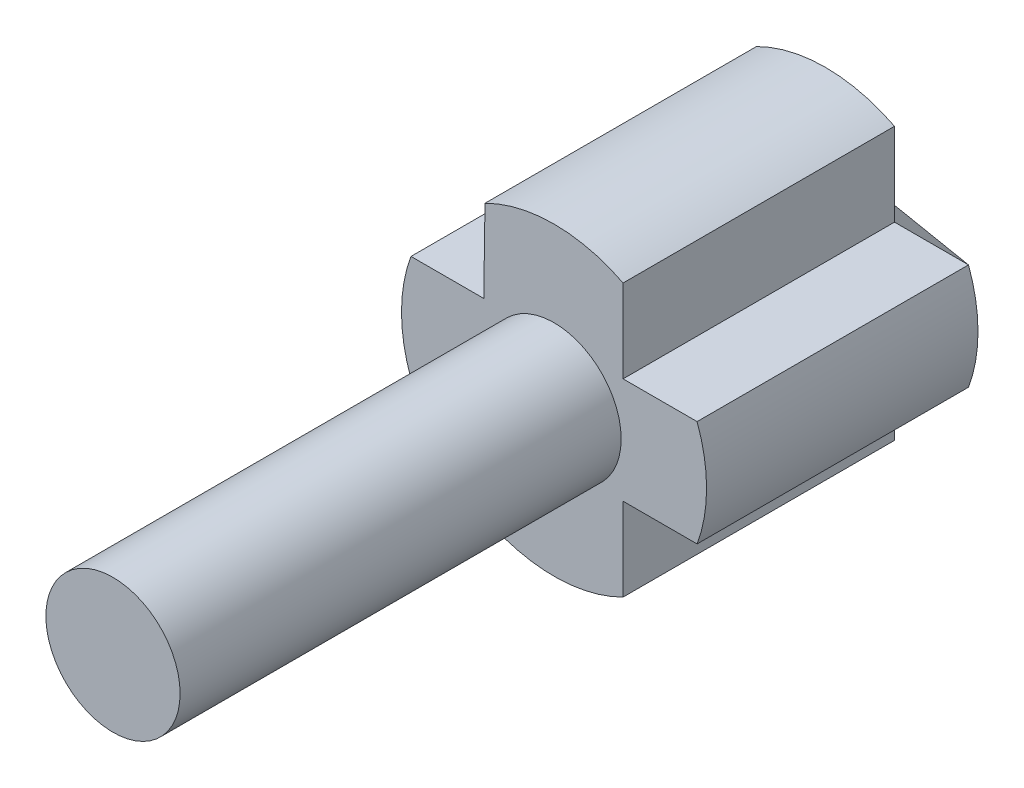
ISO-10303-21;
HEADER;
FILE_DESCRIPTION(('STEP AP214'),'2;1');
FILE_NAME('part.step','',(''),(''),'','','');
FILE_SCHEMA(('AUTOMOTIVE_DESIGN { 1 0 10303 214 1 1 1 1 }'));
ENDSEC;
DATA;
#1=APPLICATION_CONTEXT('core data for automotive mechanical design processes');
#2=APPLICATION_PROTOCOL_DEFINITION('international standard','automotive_design',2000,#1);
#3=PRODUCT_CONTEXT('',#1,'mechanical');
#4=PRODUCT('Part','Part','',(#3));
#5=PRODUCT_RELATED_PRODUCT_CATEGORY('part','',(#4));
#6=PRODUCT_DEFINITION_FORMATION('','',#4);
#7=PRODUCT_DEFINITION_CONTEXT('part definition',#1,'design');
#8=PRODUCT_DEFINITION('design','',#6,#7);
#9=PRODUCT_DEFINITION_SHAPE('','',#8);
#10=(LENGTH_UNIT() NAMED_UNIT(*) SI_UNIT(.MILLI.,.METRE.));
#11=(NAMED_UNIT(*) PLANE_ANGLE_UNIT() SI_UNIT($,.RADIAN.));
#12=(NAMED_UNIT(*) SI_UNIT($,.STERADIAN.) SOLID_ANGLE_UNIT());
#13=UNCERTAINTY_MEASURE_WITH_UNIT(LENGTH_MEASURE(1.E-05),#10,'distance_accuracy_value','');
#14=(GEOMETRIC_REPRESENTATION_CONTEXT(3) GLOBAL_UNCERTAINTY_ASSIGNED_CONTEXT((#13)) GLOBAL_UNIT_ASSIGNED_CONTEXT((#10,
#11,#12)) REPRESENTATION_CONTEXT('',''));
#15=CARTESIAN_POINT('',(0.,0.,0.));
#16=DIRECTION('',(0.,0.,1.));
#17=DIRECTION('',(1.,0.,0.));
#18=AXIS2_PLACEMENT_3D('',#15,#16,#17);
#19=CARTESIAN_POINT('',(0.,0.,130.));
#20=DIRECTION('',(0.,0.,-1.));
#21=DIRECTION('',(-1.,0.,0.));
#22=AXIS2_PLACEMENT_3D('',#19,#20,#21);
#23=CYLINDRICAL_SURFACE('',#22,19.7830134605546);
#24=CARTESIAN_POINT('',(0.,0.,130.));
#25=DIRECTION('',(0.,0.,1.));
#26=DIRECTION('',(1.,0.,0.));
#27=AXIS2_PLACEMENT_3D('',#24,#25,#26);
#28=CIRCLE('',#27,19.7830134605546);
#29=CARTESIAN_POINT('',(19.7830134605546,0.,130.));
#30=VERTEX_POINT('',#29);
#31=EDGE_CURVE('E12',#30,#30,#28,.T.);
#32=ORIENTED_EDGE('',*,*,#31,.F.);
#33=EDGE_LOOP('',(#32));
#34=FACE_BOUND('',#33,.T.);
#35=CARTESIAN_POINT('',(0.,0.,0.));
#36=DIRECTION('',(0.,0.,1.));
#37=DIRECTION('',(1.,0.,0.));
#38=AXIS2_PLACEMENT_3D('',#35,#36,#37);
#39=CIRCLE('',#38,19.7830134605546);
#40=CARTESIAN_POINT('',(19.7830134605546,0.,0.));
#41=VERTEX_POINT('',#40);
#42=EDGE_CURVE('E75',#41,#41,#39,.T.);
#43=ORIENTED_EDGE('',*,*,#42,.T.);
#44=EDGE_LOOP('',(#43));
#45=FACE_BOUND('',#44,.T.);
#46=ADVANCED_FACE('F65',(#34,#45),#23,.T.);
#47=CARTESIAN_POINT('',(0.,0.,130.));
#48=DIRECTION('',(0.,0.,1.));
#49=DIRECTION('',(1.,0.,0.));
#50=AXIS2_PLACEMENT_3D('',#47,#48,#49);
#51=PLANE('',#50);
#52=ORIENTED_EDGE('',*,*,#31,.T.);
#53=EDGE_LOOP('',(#52));
#54=FACE_BOUND('',#53,.T.);
#55=ADVANCED_FACE('F422',(#54),#51,.T.);
#56=CARTESIAN_POINT('',(42.1631050170094,15.615730370312,-80.));
#57=DIRECTION('',(0.,-1.,0.));
#58=DIRECTION('',(1.,0.,0.));
#59=AXIS2_PLACEMENT_3D('',#56,#57,#58);
#60=PLANE('',#59);
#61=DIRECTION('',(1.,0.,0.));
#62=VECTOR('',#61,1.);
#63=CARTESIAN_POINT('',(42.1631050170094,15.615730370312,0.));
#64=LINE('',#63,#62);
#65=CARTESIAN_POINT('',(20.3514494606447,15.615730370312,0.));
#66=VERTEX_POINT('',#65);
#67=CARTESIAN_POINT('',(42.1631050170094,15.615730370312,0.));
#68=VERTEX_POINT('',#67);
#69=EDGE_CURVE('E188',#66,#68,#64,.T.);
#70=ORIENTED_EDGE('',*,*,#69,.T.);
#71=DIRECTION('',(0.,0.,1.));
#72=VECTOR('',#71,1.);
#73=CARTESIAN_POINT('',(42.1631050170094,15.615730370312,-80.));
#74=LINE('',#73,#72);
#75=CARTESIAN_POINT('',(42.1631050170094,15.615730370312,-80.));
#76=VERTEX_POINT('',#75);
#77=EDGE_CURVE('E175',#76,#68,#74,.T.);
#78=ORIENTED_EDGE('',*,*,#77,.F.);
#79=DIRECTION('',(1.,0.,0.));
#80=VECTOR('',#79,1.);
#81=CARTESIAN_POINT('',(0.,15.615730370312,-80.));
#82=LINE('',#81,#80);
#83=CARTESIAN_POINT('',(20.3514494606447,15.615730370312,-80.));
#84=VERTEX_POINT('',#83);
#85=EDGE_CURVE('E68',#84,#76,#82,.T.);
#86=ORIENTED_EDGE('',*,*,#85,.F.);
#87=DIRECTION('',(0.,0.,1.));
#88=VECTOR('',#87,1.);
#89=CARTESIAN_POINT('',(20.3514494606447,15.615730370312,-80.));
#90=LINE('',#89,#88);
#91=EDGE_CURVE('E273',#84,#66,#90,.T.);
#92=ORIENTED_EDGE('',*,*,#91,.T.);
#93=EDGE_LOOP('',(#70,#78,#86,#92));
#94=FACE_BOUND('',#93,.T.);
#95=ADVANCED_FACE('F186',(#94),#60,.F.);
#96=CARTESIAN_POINT('',(0.,0.,-80.));
#97=DIRECTION('',(0.,0.,1.));
#98=DIRECTION('',(1.,0.,0.));
#99=AXIS2_PLACEMENT_3D('',#96,#97,#98);
#100=CYLINDRICAL_SURFACE('',#99,44.9619668127813);
#101=CARTESIAN_POINT('',(0.,0.,0.));
#102=DIRECTION('',(0.,0.,-1.));
#103=DIRECTION('',(-1.,0.,0.));
#104=AXIS2_PLACEMENT_3D('',#101,#102,#103);
#105=CIRCLE('',#104,44.9619668127813);
#106=CARTESIAN_POINT('',(42.1631050170094,-15.6157303703121,0.));
#107=VERTEX_POINT('',#106);
#108=EDGE_CURVE('E239',#68,#107,#105,.T.);
#109=ORIENTED_EDGE('',*,*,#108,.T.);
#110=DIRECTION('',(0.,0.,1.));
#111=VECTOR('',#110,1.);
#112=CARTESIAN_POINT('',(42.1631050170094,-15.6157303703121,-80.));
#113=LINE('',#112,#111);
#114=CARTESIAN_POINT('',(42.1631050170094,-15.615730370312,-80.));
#115=VERTEX_POINT('',#114);
#116=EDGE_CURVE('E178',#115,#107,#113,.T.);
#117=ORIENTED_EDGE('',*,*,#116,.F.);
#118=CARTESIAN_POINT('',(0.,0.,-80.));
#119=DIRECTION('',(0.,0.,1.));
#120=DIRECTION('',(1.,0.,0.));
#121=AXIS2_PLACEMENT_3D('',#118,#119,#120);
#122=CIRCLE('',#121,44.9619668127813);
#123=EDGE_CURVE('E173',#76,#115,#122,.F.);
#124=ORIENTED_EDGE('',*,*,#123,.F.);
#125=ORIENTED_EDGE('',*,*,#77,.T.);
#126=EDGE_LOOP('',(#109,#117,#124,#125));
#127=FACE_BOUND('',#126,.T.);
#128=ADVANCED_FACE('F174',(#127),#100,.T.);
#129=CARTESIAN_POINT('',(42.1631050170094,-15.6157303703121,-80.));
#130=DIRECTION('',(0.,1.,0.));
#131=DIRECTION('',(-1.,0.,0.));
#132=AXIS2_PLACEMENT_3D('',#129,#130,#131);
#133=PLANE('',#132);
#134=DIRECTION('',(-1.,0.,0.));
#135=VECTOR('',#134,1.);
#136=CARTESIAN_POINT('',(42.1631050170094,-15.6157303703121,0.));
#137=LINE('',#136,#135);
#138=CARTESIAN_POINT('',(20.3514494606447,-15.6157303703121,0.));
#139=VERTEX_POINT('',#138);
#140=EDGE_CURVE('E242',#107,#139,#137,.T.);
#141=ORIENTED_EDGE('',*,*,#140,.T.);
#142=DIRECTION('',(0.,0.,1.));
#143=VECTOR('',#142,1.);
#144=CARTESIAN_POINT('',(20.3514494606447,-15.6157303703121,-80.));
#145=LINE('',#144,#143);
#146=CARTESIAN_POINT('',(20.3514494606447,-15.6157303703121,-80.));
#147=VERTEX_POINT('',#146);
#148=EDGE_CURVE('E306',#147,#139,#145,.T.);
#149=ORIENTED_EDGE('',*,*,#148,.F.);
#150=DIRECTION('',(1.,0.,0.));
#151=VECTOR('',#150,1.);
#152=CARTESIAN_POINT('',(0.,-15.6157303703121,-80.));
#153=LINE('',#152,#151);
#154=EDGE_CURVE('E185',#115,#147,#153,.F.);
#155=ORIENTED_EDGE('',*,*,#154,.F.);
#156=ORIENTED_EDGE('',*,*,#116,.T.);
#157=EDGE_LOOP('',(#141,#149,#155,#156));
#158=FACE_BOUND('',#157,.T.);
#159=ADVANCED_FACE('F390',(#158),#133,.F.);
#160=CARTESIAN_POINT('',(20.3514494606447,-15.6157303703121,-80.));
#161=DIRECTION('',(-1.,0.,0.));
#162=DIRECTION('',(0.,0.,1.));
#163=AXIS2_PLACEMENT_3D('',#160,#161,#162);
#164=PLANE('',#163);
#165=DIRECTION('',(0.,-1.,0.));
#166=VECTOR('',#165,1.);
#167=CARTESIAN_POINT('',(20.3514494606447,-15.6157303703121,0.));
#168=LINE('',#167,#166);
#169=CARTESIAN_POINT('',(20.3514494606447,-40.0923554374705,0.));
#170=VERTEX_POINT('',#169);
#171=EDGE_CURVE('E245',#139,#170,#168,.T.);
#172=ORIENTED_EDGE('',*,*,#171,.T.);
#173=DIRECTION('',(0.,0.,1.));
#174=VECTOR('',#173,1.);
#175=CARTESIAN_POINT('',(20.3514494606447,-40.0923554374705,-80.));
#176=LINE('',#175,#174);
#177=CARTESIAN_POINT('',(20.3514494606447,-40.0923554374705,-80.));
#178=VERTEX_POINT('',#177);
#179=EDGE_CURVE('E302',#178,#170,#176,.T.);
#180=ORIENTED_EDGE('',*,*,#179,.F.);
#181=DIRECTION('',(0.,1.,0.));
#182=VECTOR('',#181,1.);
#183=CARTESIAN_POINT('',(20.3514494606447,0.,-80.));
#184=LINE('',#183,#182);
#185=EDGE_CURVE('E342',#147,#178,#184,.F.);
#186=ORIENTED_EDGE('',*,*,#185,.F.);
#187=ORIENTED_EDGE('',*,*,#148,.T.);
#188=EDGE_LOOP('',(#172,#180,#186,#187));
#189=FACE_BOUND('',#188,.T.);
#190=ADVANCED_FACE('F392',(#189),#164,.F.);
#191=CARTESIAN_POINT('',(0.,0.,-80.));
#192=DIRECTION('',(0.,0.,1.));
#193=DIRECTION('',(1.,0.,0.));
#194=AXIS2_PLACEMENT_3D('',#191,#192,#193);
#195=CYLINDRICAL_SURFACE('',#194,44.9619668127813);
#196=CARTESIAN_POINT('',(0.,0.,0.));
#197=DIRECTION('',(0.,0.,-1.));
#198=DIRECTION('',(-1.,0.,0.));
#199=AXIS2_PLACEMENT_3D('',#196,#197,#198);
#200=CIRCLE('',#199,44.9619668127813);
#201=CARTESIAN_POINT('',(-21.5396845590046,-39.4667005052643,0.));
#202=VERTEX_POINT('',#201);
#203=EDGE_CURVE('E248',#170,#202,#200,.T.);
#204=ORIENTED_EDGE('',*,*,#203,.T.);
#205=DIRECTION('',(0.,0.,1.));
#206=VECTOR('',#205,1.);
#207=CARTESIAN_POINT('',(-21.5396845590046,-39.4667005052643,-80.));
#208=LINE('',#207,#206);
#209=CARTESIAN_POINT('',(-21.5396845590046,-39.4667005052643,-80.));
#210=VERTEX_POINT('',#209);
#211=EDGE_CURVE('E298',#210,#202,#208,.T.);
#212=ORIENTED_EDGE('',*,*,#211,.F.);
#213=CARTESIAN_POINT('',(0.,0.,-80.));
#214=DIRECTION('',(0.,0.,1.));
#215=DIRECTION('',(1.,0.,0.));
#216=AXIS2_PLACEMENT_3D('',#213,#214,#215);
#217=CIRCLE('',#216,44.9619668127813);
#218=EDGE_CURVE('E338',#178,#210,#217,.F.);
#219=ORIENTED_EDGE('',*,*,#218,.F.);
#220=ORIENTED_EDGE('',*,*,#179,.T.);
#221=EDGE_LOOP('',(#204,#212,#219,#220));
#222=FACE_BOUND('',#221,.T.);
#223=ADVANCED_FACE('F397',(#222),#195,.T.);
#224=CARTESIAN_POINT('',(-21.1834641450182,-15.6157303703121,-80.));
#225=DIRECTION('',(0.999888487676063,-0.0149335934347671,0.));
#226=DIRECTION('',(0.0149335934347671,0.999888487676063,0.));
#227=AXIS2_PLACEMENT_3D('',#224,#225,#226);
#228=PLANE('',#227);
#229=DIRECTION('',(0.0149335934347671,0.999888487676063,0.));
#230=VECTOR('',#229,1.);
#231=CARTESIAN_POINT('',(-21.1834641450182,-15.6157303703121,0.));
#232=LINE('',#231,#230);
#233=CARTESIAN_POINT('',(-21.1834641450182,-15.6157303703121,0.));
#234=VERTEX_POINT('',#233);
#235=EDGE_CURVE('E251',#202,#234,#232,.T.);
#236=ORIENTED_EDGE('',*,*,#235,.T.);
#237=DIRECTION('',(0.,0.,1.));
#238=VECTOR('',#237,1.);
#239=CARTESIAN_POINT('',(-21.1834641450182,-15.6157303703121,-80.));
#240=LINE('',#239,#238);
#241=CARTESIAN_POINT('',(-21.1834641450182,-15.6157303703121,-80.));
#242=VERTEX_POINT('',#241);
#243=EDGE_CURVE('E294',#242,#234,#240,.T.);
#244=ORIENTED_EDGE('',*,*,#243,.F.);
#245=DIRECTION('',(-0.0149335934347665,-0.999888487676063,0.));
#246=VECTOR('',#245,1.);
#247=CARTESIAN_POINT('',(-21.1834641450182,-15.6157303703121,-80.));
#248=LINE('',#247,#246);
#249=EDGE_CURVE('E334',#210,#242,#248,.F.);
#250=ORIENTED_EDGE('',*,*,#249,.F.);
#251=ORIENTED_EDGE('',*,*,#211,.T.);
#252=EDGE_LOOP('',(#236,#244,#250,#251));
#253=FACE_BOUND('',#252,.T.);
#254=ADVANCED_FACE('F399',(#253),#228,.F.);
#255=CARTESIAN_POINT('',(-21.1834641450182,-15.6157303703121,-80.));
#256=DIRECTION('',(0.,1.,0.));
#257=DIRECTION('',(-1.,0.,0.));
#258=AXIS2_PLACEMENT_3D('',#255,#256,#257);
#259=PLANE('',#258);
#260=DIRECTION('',(-1.,0.,0.));
#261=VECTOR('',#260,1.);
#262=CARTESIAN_POINT('',(-21.1834641450182,-15.6157303703121,0.));
#263=LINE('',#262,#261);
#264=CARTESIAN_POINT('',(-42.1631050170094,-15.6157303703121,0.));
#265=VERTEX_POINT('',#264);
#266=EDGE_CURVE('E254',#234,#265,#263,.T.);
#267=ORIENTED_EDGE('',*,*,#266,.T.);
#268=DIRECTION('',(0.,0.,1.));
#269=VECTOR('',#268,1.);
#270=CARTESIAN_POINT('',(-42.1631050170094,-15.6157303703121,-80.));
#271=LINE('',#270,#269);
#272=CARTESIAN_POINT('',(-42.1631050170093,-15.6157303703121,-80.));
#273=VERTEX_POINT('',#272);
#274=EDGE_CURVE('E290',#273,#265,#271,.T.);
#275=ORIENTED_EDGE('',*,*,#274,.F.);
#276=DIRECTION('',(1.,0.,0.));
#277=VECTOR('',#276,1.);
#278=CARTESIAN_POINT('',(0.,-15.615730370312,-80.));
#279=LINE('',#278,#277);
#280=EDGE_CURVE('E330',#242,#273,#279,.F.);
#281=ORIENTED_EDGE('',*,*,#280,.F.);
#282=ORIENTED_EDGE('',*,*,#243,.T.);
#283=EDGE_LOOP('',(#267,#275,#281,#282));
#284=FACE_BOUND('',#283,.T.);
#285=ADVANCED_FACE('F401',(#284),#259,.F.);
#286=CARTESIAN_POINT('',(0.,0.,-80.));
#287=DIRECTION('',(0.,0.,1.));
#288=DIRECTION('',(1.,0.,0.));
#289=AXIS2_PLACEMENT_3D('',#286,#287,#288);
#290=CYLINDRICAL_SURFACE('',#289,44.9619668127813);
#291=CARTESIAN_POINT('',(0.,0.,0.));
#292=DIRECTION('',(0.,0.,-1.));
#293=DIRECTION('',(-1.,0.,0.));
#294=AXIS2_PLACEMENT_3D('',#291,#292,#293);
#295=CIRCLE('',#294,44.9619668127813);
#296=CARTESIAN_POINT('',(-42.1631050170094,15.615730370312,0.));
#297=VERTEX_POINT('',#296);
#298=EDGE_CURVE('E257',#265,#297,#295,.T.);
#299=ORIENTED_EDGE('',*,*,#298,.T.);
#300=DIRECTION('',(0.,0.,1.));
#301=VECTOR('',#300,1.);
#302=CARTESIAN_POINT('',(-42.1631050170094,15.615730370312,-80.));
#303=LINE('',#302,#301);
#304=CARTESIAN_POINT('',(-42.1631050170093,15.615730370312,-80.));
#305=VERTEX_POINT('',#304);
#306=EDGE_CURVE('E286',#305,#297,#303,.T.);
#307=ORIENTED_EDGE('',*,*,#306,.F.);
#308=CARTESIAN_POINT('',(0.,0.,-80.));
#309=DIRECTION('',(0.,0.,1.));
#310=DIRECTION('',(1.,0.,0.));
#311=AXIS2_PLACEMENT_3D('',#308,#309,#310);
#312=CIRCLE('',#311,44.9619668127813);
#313=EDGE_CURVE('E326',#273,#305,#312,.F.);
#314=ORIENTED_EDGE('',*,*,#313,.F.);
#315=ORIENTED_EDGE('',*,*,#274,.T.);
#316=EDGE_LOOP('',(#299,#307,#314,#315));
#317=FACE_BOUND('',#316,.T.);
#318=ADVANCED_FACE('F404',(#317),#290,.T.);
#319=CARTESIAN_POINT('',(-20.7170141930257,15.615730370312,-80.));
#320=DIRECTION('',(0.,-1.,0.));
#321=DIRECTION('',(1.,0.,0.));
#322=AXIS2_PLACEMENT_3D('',#319,#320,#321);
#323=PLANE('',#322);
#324=DIRECTION('',(1.,0.,0.));
#325=VECTOR('',#324,1.);
#326=CARTESIAN_POINT('',(-20.7170141930257,15.615730370312,0.));
#327=LINE('',#326,#325);
#328=CARTESIAN_POINT('',(-20.7170141930257,15.615730370312,0.));
#329=VERTEX_POINT('',#328);
#330=EDGE_CURVE('E260',#297,#329,#327,.T.);
#331=ORIENTED_EDGE('',*,*,#330,.T.);
#332=DIRECTION('',(0.,0.,1.));
#333=VECTOR('',#332,1.);
#334=CARTESIAN_POINT('',(-20.7170141930257,15.615730370312,-80.));
#335=LINE('',#334,#333);
#336=CARTESIAN_POINT('',(-20.7170141930257,15.615730370312,-80.));
#337=VERTEX_POINT('',#336);
#338=EDGE_CURVE('E282',#337,#329,#335,.T.);
#339=ORIENTED_EDGE('',*,*,#338,.F.);
#340=DIRECTION('',(1.,0.,0.));
#341=VECTOR('',#340,1.);
#342=CARTESIAN_POINT('',(0.,15.615730370312,-80.));
#343=LINE('',#342,#341);
#344=EDGE_CURVE('E322',#305,#337,#343,.T.);
#345=ORIENTED_EDGE('',*,*,#344,.F.);
#346=ORIENTED_EDGE('',*,*,#306,.T.);
#347=EDGE_LOOP('',(#331,#339,#345,#346));
#348=FACE_BOUND('',#347,.T.);
#349=ADVANCED_FACE('F407',(#348),#323,.F.);
#350=CARTESIAN_POINT('',(-20.3514494606447,40.0923554374705,-80.));
#351=DIRECTION('',(0.999888487676063,-0.0149335934347666,0.));
#352=DIRECTION('',(0.0149335934347666,0.999888487676063,0.));
#353=AXIS2_PLACEMENT_3D('',#350,#351,#352);
#354=PLANE('',#353);
#355=DIRECTION('',(0.0149335934347666,0.999888487676063,0.));
#356=VECTOR('',#355,1.);
#357=CARTESIAN_POINT('',(-20.3514494606447,40.0923554374705,0.));
#358=LINE('',#357,#356);
#359=CARTESIAN_POINT('',(-20.3514494606447,40.0923554374705,0.));
#360=VERTEX_POINT('',#359);
#361=EDGE_CURVE('E263',#329,#360,#358,.T.);
#362=ORIENTED_EDGE('',*,*,#361,.T.);
#363=DIRECTION('',(0.,0.,1.));
#364=VECTOR('',#363,1.);
#365=CARTESIAN_POINT('',(-20.3514494606447,40.0923554374705,-80.));
#366=LINE('',#365,#364);
#367=CARTESIAN_POINT('',(-20.3514494606447,40.0923554374705,-80.));
#368=VERTEX_POINT('',#367);
#369=EDGE_CURVE('E279',#368,#360,#366,.T.);
#370=ORIENTED_EDGE('',*,*,#369,.F.);
#371=DIRECTION('',(-0.0149335934347668,-0.999888487676063,0.));
#372=VECTOR('',#371,1.);
#373=CARTESIAN_POINT('',(-20.3514494606447,40.0923554374705,-80.));
#374=LINE('',#373,#372);
#375=EDGE_CURVE('E318',#337,#368,#374,.F.);
#376=ORIENTED_EDGE('',*,*,#375,.F.);
#377=ORIENTED_EDGE('',*,*,#338,.T.);
#378=EDGE_LOOP('',(#362,#370,#376,#377));
#379=FACE_BOUND('',#378,.T.);
#380=ADVANCED_FACE('F410',(#379),#354,.F.);
#381=CARTESIAN_POINT('',(0.,0.,-80.));
#382=DIRECTION('',(0.,0.,1.));
#383=DIRECTION('',(1.,0.,0.));
#384=AXIS2_PLACEMENT_3D('',#381,#382,#383);
#385=CYLINDRICAL_SURFACE('',#384,44.9619668127813);
#386=CARTESIAN_POINT('',(0.,0.,0.));
#387=DIRECTION('',(0.,0.,-1.));
#388=DIRECTION('',(-1.,0.,0.));
#389=AXIS2_PLACEMENT_3D('',#386,#387,#388);
#390=CIRCLE('',#389,44.9619668127813);
#391=CARTESIAN_POINT('',(20.3514494606447,40.0923554374705,0.));
#392=VERTEX_POINT('',#391);
#393=EDGE_CURVE('E164',#360,#392,#390,.T.);
#394=ORIENTED_EDGE('',*,*,#393,.T.);
#395=DIRECTION('',(0.,0.,1.));
#396=VECTOR('',#395,1.);
#397=CARTESIAN_POINT('',(20.3514494606447,40.0923554374705,-80.));
#398=LINE('',#397,#396);
#399=CARTESIAN_POINT('',(20.3514494606447,40.0923554374705,-80.));
#400=VERTEX_POINT('',#399);
#401=EDGE_CURVE('E84',#400,#392,#398,.T.);
#402=ORIENTED_EDGE('',*,*,#401,.F.);
#403=CARTESIAN_POINT('',(0.,0.,-80.));
#404=DIRECTION('',(0.,0.,1.));
#405=DIRECTION('',(1.,0.,0.));
#406=AXIS2_PLACEMENT_3D('',#403,#404,#405);
#407=CIRCLE('',#406,44.9619668127813);
#408=EDGE_CURVE('E315',#368,#400,#407,.F.);
#409=ORIENTED_EDGE('',*,*,#408,.F.);
#410=ORIENTED_EDGE('',*,*,#369,.T.);
#411=EDGE_LOOP('',(#394,#402,#409,#410));
#412=FACE_BOUND('',#411,.T.);
#413=ADVANCED_FACE('F411',(#412),#385,.T.);
#414=CARTESIAN_POINT('',(20.3514494606447,40.0923554374705,-80.));
#415=DIRECTION('',(-1.,0.,0.));
#416=DIRECTION('',(0.,0.,1.));
#417=AXIS2_PLACEMENT_3D('',#414,#415,#416);
#418=PLANE('',#417);
#419=DIRECTION('',(0.,-1.,0.));
#420=VECTOR('',#419,1.);
#421=CARTESIAN_POINT('',(20.3514494606447,40.0923554374705,0.));
#422=LINE('',#421,#420);
#423=EDGE_CURVE('E168',#392,#66,#422,.T.);
#424=ORIENTED_EDGE('',*,*,#423,.T.);
#425=ORIENTED_EDGE('',*,*,#91,.F.);
#426=DIRECTION('',(0.,1.,0.));
#427=VECTOR('',#426,1.);
#428=CARTESIAN_POINT('',(20.3514494606447,0.,-80.));
#429=LINE('',#428,#427);
#430=EDGE_CURVE('E276',#400,#84,#429,.F.);
#431=ORIENTED_EDGE('',*,*,#430,.F.);
#432=ORIENTED_EDGE('',*,*,#401,.T.);
#433=EDGE_LOOP('',(#424,#425,#431,#432));
#434=FACE_BOUND('',#433,.T.);
#435=ADVANCED_FACE('F385',(#434),#418,.F.);
#436=CARTESIAN_POINT('',(0.,0.,0.));
#437=DIRECTION('',(0.,0.,-1.));
#438=DIRECTION('',(-1.,0.,0.));
#439=AXIS2_PLACEMENT_3D('',#436,#437,#438);
#440=PLANE('',#439);
#441=ORIENTED_EDGE('',*,*,#42,.F.);
#442=EDGE_LOOP('',(#441));
#443=FACE_BOUND('',#442,.T.);
#444=ORIENTED_EDGE('',*,*,#69,.F.);
#445=ORIENTED_EDGE('',*,*,#423,.F.);
#446=ORIENTED_EDGE('',*,*,#393,.F.);
#447=ORIENTED_EDGE('',*,*,#361,.F.);
#448=ORIENTED_EDGE('',*,*,#330,.F.);
#449=ORIENTED_EDGE('',*,*,#298,.F.);
#450=ORIENTED_EDGE('',*,*,#266,.F.);
#451=ORIENTED_EDGE('',*,*,#235,.F.);
#452=ORIENTED_EDGE('',*,*,#203,.F.);
#453=ORIENTED_EDGE('',*,*,#171,.F.);
#454=ORIENTED_EDGE('',*,*,#140,.F.);
#455=ORIENTED_EDGE('',*,*,#108,.F.);
#456=EDGE_LOOP('',(#444,#445,#446,#447,#448,#449,#450,#451,#452,#453,#454,#455));
#457=FACE_BOUND('',#456,.T.);
#458=ADVANCED_FACE('F387',(#443,#457),#440,.F.);
#459=CARTESIAN_POINT('',(0.,0.,-80.));
#460=DIRECTION('',(0.,0.,1.));
#461=DIRECTION('',(1.,0.,0.));
#462=AXIS2_PLACEMENT_3D('',#459,#460,#461);
#463=CONICAL_SURFACE('',#462,44.9619668127813,1.15225809991564);
#464=DIRECTION('',(-0.856807607121421,0.317331386448952,-0.40642528901786));
#465=VECTOR('',#464,1.);
#466=CARTESIAN_POINT('',(42.1631050170094,-15.615730370312,-80.));
#467=LINE('',#466,#465);
#468=CARTESIAN_POINT('',(0.,0.,-100.));
#469=VERTEX_POINT('',#468);
#470=EDGE_CURVE('E200',#115,#469,#467,.T.);
#471=ORIENTED_EDGE('',*,*,#470,.T.);
#472=DIRECTION('',(-0.856807607121421,-0.317331386448952,-0.40642528901786));
#473=VECTOR('',#472,1.);
#474=CARTESIAN_POINT('',(42.1631050170094,15.615730370312,-80.));
#475=LINE('',#474,#473);
#476=EDGE_CURVE('E195',#76,#469,#475,.T.);
#477=ORIENTED_EDGE('',*,*,#476,.F.);
#478=ORIENTED_EDGE('',*,*,#123,.T.);
#479=EDGE_LOOP('',(#471,#477,#478));
#480=FACE_BOUND('',#479,.T.);
#481=ADVANCED_FACE('F199',(#480),#463,.T.);
#482=CARTESIAN_POINT('',(0.,48.5072773715542,-37.8738282216064));
#483=DIRECTION('',(0.,-0.788201571797428,0.615417161132239));
#484=DIRECTION('',(0.,-0.615417161132239,-0.788201571797428));
#485=AXIS2_PLACEMENT_3D('',#482,#483,#484);
#486=PLANE('',#485);
#487=ORIENTED_EDGE('',*,*,#476,.T.);
#488=DIRECTION('',(-0.625670725751614,-0.480079090819959,-0.614866009383288));
#489=VECTOR('',#488,1.);
#490=CARTESIAN_POINT('',(20.3514494606447,15.615730370312,-80.));
#491=LINE('',#490,#489);
#492=EDGE_CURVE('E197',#84,#469,#491,.T.);
#493=ORIENTED_EDGE('',*,*,#492,.F.);
#494=ORIENTED_EDGE('',*,*,#85,.T.);
#495=EDGE_LOOP('',(#487,#493,#494));
#496=FACE_BOUND('',#495,.T.);
#497=ADVANCED_FACE('F194',(#496),#486,.F.);
#498=CARTESIAN_POINT('',(0.,-48.5072773715542,-37.8738282216065));
#499=DIRECTION('',(0.,0.788201571797427,0.61541716113224));
#500=DIRECTION('',(0.,-0.61541716113224,0.788201571797427));
#501=AXIS2_PLACEMENT_3D('',#498,#499,#500);
#502=PLANE('',#501);
#503=DIRECTION('',(-0.625670725751614,0.48007909081996,-0.614866009383288));
#504=VECTOR('',#503,1.);
#505=CARTESIAN_POINT('',(20.3514494606447,-15.6157303703121,-80.));
#506=LINE('',#505,#504);
#507=EDGE_CURVE('E202',#147,#469,#506,.T.);
#508=ORIENTED_EDGE('',*,*,#507,.T.);
#509=ORIENTED_EDGE('',*,*,#470,.F.);
#510=ORIENTED_EDGE('',*,*,#154,.T.);
#511=EDGE_LOOP('',(#508,#509,#510));
#512=FACE_BOUND('',#511,.T.);
#513=ADVANCED_FACE('F350',(#512),#502,.F.);
#514=CARTESIAN_POINT('',(49.9924146689575,0.,-50.870905027544));
#515=DIRECTION('',(-0.700921500401122,0.,0.713238424564633));
#516=DIRECTION('',(0.713238424564634,0.,0.700921500401122));
#517=AXIS2_PLACEMENT_3D('',#514,#515,#516);
#518=PLANE('',#517);
#519=DIRECTION('',(-0.413567186448745,0.814727357304036,-0.40642528901786));
#520=VECTOR('',#519,1.);
#521=CARTESIAN_POINT('',(20.3514494606447,-40.0923554374705,-80.));
#522=LINE('',#521,#520);
#523=EDGE_CURVE('E207',#178,#469,#522,.T.);
#524=ORIENTED_EDGE('',*,*,#523,.T.);
#525=ORIENTED_EDGE('',*,*,#507,.F.);
#526=ORIENTED_EDGE('',*,*,#185,.T.);
#527=EDGE_LOOP('',(#524,#525,#526));
#528=FACE_BOUND('',#527,.T.);
#529=ADVANCED_FACE('F353',(#528),#518,.F.);
#530=CARTESIAN_POINT('',(0.,0.,-80.));
#531=DIRECTION('',(0.,0.,1.));
#532=DIRECTION('',(1.,0.,0.));
#533=AXIS2_PLACEMENT_3D('',#530,#531,#532);
#534=CONICAL_SURFACE('',#533,44.9619668127813,1.15225809991564);
#535=DIRECTION('',(0.437713626112347,0.802013257971668,-0.40642528901786));
#536=VECTOR('',#535,1.);
#537=CARTESIAN_POINT('',(-21.5396845590045,-39.4667005052643,-80.));
#538=LINE('',#537,#536);
#539=EDGE_CURVE('E216',#210,#469,#538,.T.);
#540=ORIENTED_EDGE('',*,*,#539,.T.);
#541=ORIENTED_EDGE('',*,*,#523,.F.);
#542=ORIENTED_EDGE('',*,*,#218,.T.);
#543=EDGE_LOOP('',(#540,#541,#542));
#544=FACE_BOUND('',#543,.T.);
#545=ADVANCED_FACE('F357',(#544),#534,.T.);
#546=CARTESIAN_POINT('',(-49.940871442377,0.745879844693259,-52.3136600513589));
#547=DIRECTION('',(0.690475961293695,-0.0103124372462824,0.723281826478164));
#548=DIRECTION('',(0.723320288741391,0.,-0.690512679025571));
#549=AXIS2_PLACEMENT_3D('',#546,#547,#548);
#550=PLANE('',#549);
#551=DIRECTION('',(0.640867626908134,0.472425850481715,-0.605064046674206));
#552=VECTOR('',#551,1.);
#553=CARTESIAN_POINT('',(-21.1834641450182,-15.6157303703121,-80.));
#554=LINE('',#553,#552);
#555=EDGE_CURVE('E220',#242,#469,#554,.T.);
#556=ORIENTED_EDGE('',*,*,#555,.T.);
#557=ORIENTED_EDGE('',*,*,#539,.F.);
#558=ORIENTED_EDGE('',*,*,#249,.T.);
#559=EDGE_LOOP('',(#556,#557,#558));
#560=FACE_BOUND('',#559,.T.);
#561=ADVANCED_FACE('F361',(#560),#550,.F.);
#562=CARTESIAN_POINT('',(0.,-48.5072773715542,-37.8738282216064));
#563=DIRECTION('',(0.,0.788201571797428,0.615417161132239));
#564=DIRECTION('',(0.,-0.615417161132239,0.788201571797428));
#565=AXIS2_PLACEMENT_3D('',#562,#563,#564);
#566=PLANE('',#565);
#567=DIRECTION('',(0.85680760712142,0.317331386448953,-0.40642528901786));
#568=VECTOR('',#567,1.);
#569=CARTESIAN_POINT('',(-42.1631050170094,-15.6157303703121,-80.));
#570=LINE('',#569,#568);
#571=EDGE_CURVE('E224',#273,#469,#570,.T.);
#572=ORIENTED_EDGE('',*,*,#571,.T.);
#573=ORIENTED_EDGE('',*,*,#555,.F.);
#574=ORIENTED_EDGE('',*,*,#280,.T.);
#575=EDGE_LOOP('',(#572,#573,#574));
#576=FACE_BOUND('',#575,.T.);
#577=ADVANCED_FACE('F365',(#576),#566,.F.);
#578=CARTESIAN_POINT('',(0.,0.,-80.));
#579=DIRECTION('',(0.,0.,1.));
#580=DIRECTION('',(1.,0.,0.));
#581=AXIS2_PLACEMENT_3D('',#578,#579,#580);
#582=CONICAL_SURFACE('',#581,44.9619668127813,1.15225809991564);
#583=DIRECTION('',(0.85680760712142,-0.317331386448953,-0.40642528901786));
#584=VECTOR('',#583,1.);
#585=CARTESIAN_POINT('',(-42.1631050170094,15.6157303703121,-80.));
#586=LINE('',#585,#584);
#587=EDGE_CURVE('E228',#305,#469,#586,.T.);
#588=ORIENTED_EDGE('',*,*,#587,.T.);
#589=ORIENTED_EDGE('',*,*,#571,.F.);
#590=ORIENTED_EDGE('',*,*,#313,.T.);
#591=EDGE_LOOP('',(#588,#589,#590));
#592=FACE_BOUND('',#591,.T.);
#593=ADVANCED_FACE('F369',(#592),#582,.T.);
#594=CARTESIAN_POINT('',(0.,48.5072773715542,-37.8738282216064));
#595=DIRECTION('',(0.,-0.788201571797428,0.615417161132239));
#596=DIRECTION('',(0.,-0.615417161132239,-0.788201571797428));
#597=AXIS2_PLACEMENT_3D('',#594,#595,#596);
#598=PLANE('',#597);
#599=DIRECTION('',(0.632438138715378,-0.476708822905863,-0.610549505660217));
#600=VECTOR('',#599,1.);
#601=CARTESIAN_POINT('',(-20.7170141930257,15.615730370312,-80.));
#602=LINE('',#601,#600);
#603=EDGE_CURVE('E232',#337,#469,#602,.T.);
#604=ORIENTED_EDGE('',*,*,#603,.T.);
#605=ORIENTED_EDGE('',*,*,#587,.F.);
#606=ORIENTED_EDGE('',*,*,#344,.T.);
#607=EDGE_LOOP('',(#604,#605,#606));
#608=FACE_BOUND('',#607,.T.);
#609=ADVANCED_FACE('F373',(#608),#598,.F.);
#610=CARTESIAN_POINT('',(-49.940871442377,0.745879844693265,-52.3136600513589));
#611=DIRECTION('',(0.690475961293695,-0.0103124372462825,0.723281826478164));
#612=DIRECTION('',(0.723320288741391,0.,-0.690512679025571));
#613=AXIS2_PLACEMENT_3D('',#610,#611,#612);
#614=PLANE('',#613);
#615=DIRECTION('',(0.413567186448745,-0.814727357304036,-0.40642528901786));
#616=VECTOR('',#615,1.);
#617=CARTESIAN_POINT('',(-20.3514494606447,40.0923554374705,-80.));
#618=LINE('',#617,#616);
#619=EDGE_CURVE('E236',#368,#469,#618,.T.);
#620=ORIENTED_EDGE('',*,*,#619,.T.);
#621=ORIENTED_EDGE('',*,*,#603,.F.);
#622=ORIENTED_EDGE('',*,*,#375,.T.);
#623=EDGE_LOOP('',(#620,#621,#622));
#624=FACE_BOUND('',#623,.T.);
#625=ADVANCED_FACE('F377',(#624),#614,.F.);
#626=CARTESIAN_POINT('',(0.,0.,-80.));
#627=DIRECTION('',(0.,0.,1.));
#628=DIRECTION('',(1.,0.,0.));
#629=AXIS2_PLACEMENT_3D('',#626,#627,#628);
#630=CONICAL_SURFACE('',#629,44.9619668127813,1.15225809991564);
#631=DIRECTION('',(-0.413567186448745,-0.814727357304036,-0.40642528901786));
#632=VECTOR('',#631,1.);
#633=CARTESIAN_POINT('',(20.3514494606447,40.0923554374705,-80.));
#634=LINE('',#633,#632);
#635=EDGE_CURVE('E130',#400,#469,#634,.T.);
#636=ORIENTED_EDGE('',*,*,#635,.T.);
#637=ORIENTED_EDGE('',*,*,#619,.F.);
#638=ORIENTED_EDGE('',*,*,#408,.T.);
#639=EDGE_LOOP('',(#636,#637,#638));
#640=FACE_BOUND('',#639,.T.);
#641=ADVANCED_FACE('F412',(#640),#630,.T.);
#642=CARTESIAN_POINT('',(49.9924146689575,0.,-50.8709050275441));
#643=DIRECTION('',(-0.700921500401121,0.,0.713238424564634));
#644=DIRECTION('',(0.713238424564634,0.,0.700921500401121));
#645=AXIS2_PLACEMENT_3D('',#642,#643,#644);
#646=PLANE('',#645);
#647=ORIENTED_EDGE('',*,*,#492,.T.);
#648=ORIENTED_EDGE('',*,*,#635,.F.);
#649=ORIENTED_EDGE('',*,*,#430,.T.);
#650=EDGE_LOOP('',(#647,#648,#649));
#651=FACE_BOUND('',#650,.T.);
#652=ADVANCED_FACE('F384',(#651),#646,.F.);
#653=CLOSED_SHELL('',(#46,#55,#95,#128,#159,#190,#223,#254,#285,#318,#349,#380,#413,#435,#458,
#481,#497,#513,#529,#545,#561,#577,#593,#609,#625,#641,#652));
#654=MANIFOLD_SOLID_BREP('B2',#653);
#655=ADVANCED_BREP_SHAPE_REPRESENTATION('',(#18,#654),#14);
#656=SHAPE_DEFINITION_REPRESENTATION(#9,#655);
ENDSEC;
END-ISO-10303-21;
